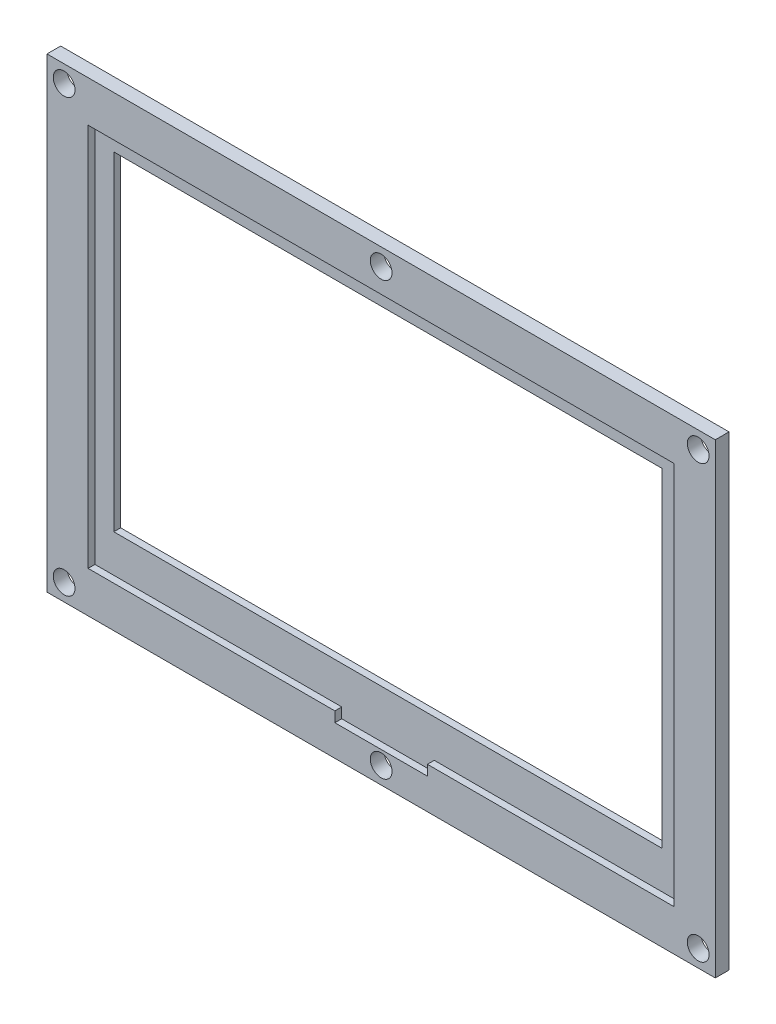
ISO-10303-21;
HEADER;
FILE_DESCRIPTION(('STEP AP214'),'2;1');
FILE_NAME('part.step','',(''),(''),'','','');
FILE_SCHEMA(('AUTOMOTIVE_DESIGN { 1 0 10303 214 1 1 1 1 }'));
ENDSEC;
DATA;
#1=APPLICATION_CONTEXT('core data for automotive mechanical design processes');
#2=APPLICATION_PROTOCOL_DEFINITION('international standard','automotive_design',2000,#1);
#3=PRODUCT_CONTEXT('',#1,'mechanical');
#4=PRODUCT('Part','Part','',(#3));
#5=PRODUCT_RELATED_PRODUCT_CATEGORY('part','',(#4));
#6=PRODUCT_DEFINITION_FORMATION('','',#4);
#7=PRODUCT_DEFINITION_CONTEXT('part definition',#1,'design');
#8=PRODUCT_DEFINITION('design','',#6,#7);
#9=PRODUCT_DEFINITION_SHAPE('','',#8);
#10=(LENGTH_UNIT() NAMED_UNIT(*) SI_UNIT(.MILLI.,.METRE.));
#11=(NAMED_UNIT(*) PLANE_ANGLE_UNIT() SI_UNIT($,.RADIAN.));
#12=(NAMED_UNIT(*) SI_UNIT($,.STERADIAN.) SOLID_ANGLE_UNIT());
#13=UNCERTAINTY_MEASURE_WITH_UNIT(LENGTH_MEASURE(1.E-05),#10,'distance_accuracy_value','');
#14=(GEOMETRIC_REPRESENTATION_CONTEXT(3) GLOBAL_UNCERTAINTY_ASSIGNED_CONTEXT((#13)) GLOBAL_UNIT_ASSIGNED_CONTEXT((#10,
#11,#12)) REPRESENTATION_CONTEXT('',''));
#15=CARTESIAN_POINT('',(0.,0.,0.));
#16=DIRECTION('',(0.,0.,1.));
#17=DIRECTION('',(1.,0.,0.));
#18=AXIS2_PLACEMENT_3D('',#15,#16,#17);
#19=CARTESIAN_POINT('',(0.,0.,0.));
#20=DIRECTION('',(0.,0.,1.));
#21=DIRECTION('',(1.,0.,0.));
#22=AXIS2_PLACEMENT_3D('',#19,#20,#21);
#23=PLANE('',#22);
#24=DIRECTION('',(-1.,0.,0.));
#25=VECTOR('',#24,1.);
#26=CARTESIAN_POINT('',(0.,-45.,0.));
#27=LINE('',#26,#25);
#28=CARTESIAN_POINT('',(80.,-45.,0.));
#29=VERTEX_POINT('',#28);
#30=CARTESIAN_POINT('',(-80.,-45.,0.));
#31=VERTEX_POINT('',#30);
#32=EDGE_CURVE('E188',#29,#31,#27,.T.);
#33=ORIENTED_EDGE('',*,*,#32,.T.);
#34=DIRECTION('',(0.,1.,0.));
#35=VECTOR('',#34,1.);
#36=CARTESIAN_POINT('',(-80.,0.,0.));
#37=LINE('',#36,#35);
#38=CARTESIAN_POINT('',(-80.,51.,0.));
#39=VERTEX_POINT('',#38);
#40=EDGE_CURVE('E193',#31,#39,#37,.T.);
#41=ORIENTED_EDGE('',*,*,#40,.T.);
#42=DIRECTION('',(-1.,0.,0.));
#43=VECTOR('',#42,1.);
#44=CARTESIAN_POINT('',(0.,51.,0.));
#45=LINE('',#44,#43);
#46=CARTESIAN_POINT('',(80.,51.,0.));
#47=VERTEX_POINT('',#46);
#48=EDGE_CURVE('E232',#47,#39,#45,.T.);
#49=ORIENTED_EDGE('',*,*,#48,.F.);
#50=DIRECTION('',(0.,1.,0.));
#51=VECTOR('',#50,1.);
#52=CARTESIAN_POINT('',(80.,0.,0.));
#53=LINE('',#52,#51);
#54=EDGE_CURVE('E204',#29,#47,#53,.T.);
#55=ORIENTED_EDGE('',*,*,#54,.F.);
#56=EDGE_LOOP('',(#33,#41,#49,#55));
#57=FACE_BOUND('',#56,.T.);
#58=DIRECTION('',(0.,-1.,0.));
#59=VECTOR('',#58,1.);
#60=CARTESIAN_POINT('',(13.4999999999999,0.,0.));
#61=LINE('',#60,#59);
#62=CARTESIAN_POINT('',(13.5,-56.,0.));
#63=VERTEX_POINT('',#62);
#64=CARTESIAN_POINT('',(13.5,-59.,0.));
#65=VERTEX_POINT('',#64);
#66=EDGE_CURVE('E63',#63,#65,#61,.T.);
#67=ORIENTED_EDGE('',*,*,#66,.F.);
#68=DIRECTION('',(-1.,0.,0.));
#69=VECTOR('',#68,1.);
#70=CARTESIAN_POINT('',(0.,-56.,0.));
#71=LINE('',#70,#69);
#72=CARTESIAN_POINT('',(85.5,-56.,0.));
#73=VERTEX_POINT('',#72);
#74=EDGE_CURVE('E186',#73,#63,#71,.T.);
#75=ORIENTED_EDGE('',*,*,#74,.F.);
#76=DIRECTION('',(0.,1.,0.));
#77=VECTOR('',#76,1.);
#78=CARTESIAN_POINT('',(85.5,0.,0.));
#79=LINE('',#78,#77);
#80=CARTESIAN_POINT('',(85.5,56.,0.));
#81=VERTEX_POINT('',#80);
#82=EDGE_CURVE('E182',#73,#81,#79,.T.);
#83=ORIENTED_EDGE('',*,*,#82,.T.);
#84=DIRECTION('',(-1.,0.,0.));
#85=VECTOR('',#84,1.);
#86=CARTESIAN_POINT('',(0.,56.,0.));
#87=LINE('',#86,#85);
#88=CARTESIAN_POINT('',(-85.5,56.,0.));
#89=VERTEX_POINT('',#88);
#90=EDGE_CURVE('E327',#81,#89,#87,.T.);
#91=ORIENTED_EDGE('',*,*,#90,.T.);
#92=DIRECTION('',(0.,1.,0.));
#93=VECTOR('',#92,1.);
#94=CARTESIAN_POINT('',(-85.5,0.,0.));
#95=LINE('',#94,#93);
#96=CARTESIAN_POINT('',(-85.5,-56.,0.));
#97=VERTEX_POINT('',#96);
#98=EDGE_CURVE('E323',#97,#89,#95,.T.);
#99=ORIENTED_EDGE('',*,*,#98,.F.);
#100=CARTESIAN_POINT('',(-13.5,-56.,0.));
#101=VERTEX_POINT('',#100);
#102=EDGE_CURVE('E315',#101,#97,#71,.T.);
#103=ORIENTED_EDGE('',*,*,#102,.F.);
#104=DIRECTION('',(0.,-1.,0.));
#105=VECTOR('',#104,1.);
#106=CARTESIAN_POINT('',(-13.5000000000001,0.,0.));
#107=LINE('',#106,#105);
#108=CARTESIAN_POINT('',(-13.5,-59.,0.));
#109=VERTEX_POINT('',#108);
#110=EDGE_CURVE('E320',#101,#109,#107,.T.);
#111=ORIENTED_EDGE('',*,*,#110,.T.);
#112=DIRECTION('',(1.,0.,0.));
#113=VECTOR('',#112,1.);
#114=CARTESIAN_POINT('',(0.,-59.,0.));
#115=LINE('',#114,#113);
#116=EDGE_CURVE('E68',#109,#65,#115,.T.);
#117=ORIENTED_EDGE('',*,*,#116,.T.);
#118=EDGE_LOOP('',(#67,#75,#83,#91,#99,#103,#111,#117));
#119=FACE_BOUND('',#118,.T.);
#120=ADVANCED_FACE('F45',(#57,#119),#23,.T.);
#121=CARTESIAN_POINT('',(0.,68.,-2.));
#122=DIRECTION('',(0.,1.,0.));
#123=DIRECTION('',(0.,0.,1.));
#124=AXIS2_PLACEMENT_3D('',#121,#122,#123);
#125=PLANE('',#124);
#126=DIRECTION('',(0.,0.,1.));
#127=VECTOR('',#126,1.);
#128=CARTESIAN_POINT('',(-97.5,68.,-2.));
#129=LINE('',#128,#127);
#130=CARTESIAN_POINT('',(-97.5,68.,-2.));
#131=VERTEX_POINT('',#130);
#132=CARTESIAN_POINT('',(-97.5,68.,2.));
#133=VERTEX_POINT('',#132);
#134=EDGE_CURVE('E243',#131,#133,#129,.T.);
#135=ORIENTED_EDGE('',*,*,#134,.T.);
#136=DIRECTION('',(-1.,0.,0.));
#137=VECTOR('',#136,1.);
#138=CARTESIAN_POINT('',(0.,68.,2.));
#139=LINE('',#138,#137);
#140=CARTESIAN_POINT('',(97.4999999999999,68.,2.));
#141=VERTEX_POINT('',#140);
#142=EDGE_CURVE('E289',#141,#133,#139,.T.);
#143=ORIENTED_EDGE('',*,*,#142,.F.);
#144=DIRECTION('',(0.,0.,1.));
#145=VECTOR('',#144,1.);
#146=CARTESIAN_POINT('',(97.4999999999999,68.,-2.));
#147=LINE('',#146,#145);
#148=CARTESIAN_POINT('',(97.4999999999999,68.,-2.));
#149=VERTEX_POINT('',#148);
#150=EDGE_CURVE('E11',#149,#141,#147,.T.);
#151=ORIENTED_EDGE('',*,*,#150,.F.);
#152=DIRECTION('',(-1.,0.,0.));
#153=VECTOR('',#152,1.);
#154=CARTESIAN_POINT('',(0.,68.,-2.));
#155=LINE('',#154,#153);
#156=EDGE_CURVE('E214',#149,#131,#155,.T.);
#157=ORIENTED_EDGE('',*,*,#156,.T.);
#158=EDGE_LOOP('',(#135,#143,#151,#157));
#159=FACE_BOUND('',#158,.T.);
#160=ADVANCED_FACE('F285',(#159),#125,.T.);
#161=CARTESIAN_POINT('',(97.4999999999999,0.,-2.));
#162=DIRECTION('',(-1.,0.,0.));
#163=DIRECTION('',(0.,0.,1.));
#164=AXIS2_PLACEMENT_3D('',#161,#162,#163);
#165=PLANE('',#164);
#166=ORIENTED_EDGE('',*,*,#150,.T.);
#167=DIRECTION('',(0.,-1.,0.));
#168=VECTOR('',#167,1.);
#169=CARTESIAN_POINT('',(97.4999999999999,0.,2.));
#170=LINE('',#169,#168);
#171=CARTESIAN_POINT('',(97.4999999999999,-68.,2.));
#172=VERTEX_POINT('',#171);
#173=EDGE_CURVE('E294',#141,#172,#170,.T.);
#174=ORIENTED_EDGE('',*,*,#173,.T.);
#175=DIRECTION('',(0.,0.,1.));
#176=VECTOR('',#175,1.);
#177=CARTESIAN_POINT('',(97.4999999999999,-68.,-2.));
#178=LINE('',#177,#176);
#179=CARTESIAN_POINT('',(97.4999999999999,-68.,-2.));
#180=VERTEX_POINT('',#179);
#181=EDGE_CURVE('E55',#180,#172,#178,.T.);
#182=ORIENTED_EDGE('',*,*,#181,.F.);
#183=DIRECTION('',(0.,-1.,0.));
#184=VECTOR('',#183,1.);
#185=CARTESIAN_POINT('',(97.4999999999999,0.,-2.));
#186=LINE('',#185,#184);
#187=EDGE_CURVE('E225',#149,#180,#186,.T.);
#188=ORIENTED_EDGE('',*,*,#187,.F.);
#189=EDGE_LOOP('',(#166,#174,#182,#188));
#190=FACE_BOUND('',#189,.T.);
#191=ADVANCED_FACE('F293',(#190),#165,.F.);
#192=CARTESIAN_POINT('',(0.,-68.,-2.));
#193=DIRECTION('',(0.,1.,0.));
#194=DIRECTION('',(0.,0.,1.));
#195=AXIS2_PLACEMENT_3D('',#192,#193,#194);
#196=PLANE('',#195);
#197=ORIENTED_EDGE('',*,*,#181,.T.);
#198=DIRECTION('',(-1.,0.,0.));
#199=VECTOR('',#198,1.);
#200=CARTESIAN_POINT('',(0.,-68.,2.));
#201=LINE('',#200,#199);
#202=CARTESIAN_POINT('',(-97.5,-68.,2.));
#203=VERTEX_POINT('',#202);
#204=EDGE_CURVE('E300',#172,#203,#201,.T.);
#205=ORIENTED_EDGE('',*,*,#204,.T.);
#206=DIRECTION('',(0.,0.,1.));
#207=VECTOR('',#206,1.);
#208=CARTESIAN_POINT('',(-97.5,-68.,-2.));
#209=LINE('',#208,#207);
#210=CARTESIAN_POINT('',(-97.5,-68.,-2.));
#211=VERTEX_POINT('',#210);
#212=EDGE_CURVE('E240',#211,#203,#209,.T.);
#213=ORIENTED_EDGE('',*,*,#212,.F.);
#214=DIRECTION('',(-1.,0.,0.));
#215=VECTOR('',#214,1.);
#216=CARTESIAN_POINT('',(0.,-68.,-2.));
#217=LINE('',#216,#215);
#218=EDGE_CURVE('E222',#180,#211,#217,.T.);
#219=ORIENTED_EDGE('',*,*,#218,.F.);
#220=EDGE_LOOP('',(#197,#205,#213,#219));
#221=FACE_BOUND('',#220,.T.);
#222=ADVANCED_FACE('F298',(#221),#196,.F.);
#223=CARTESIAN_POINT('',(0.,-45.,-2.));
#224=DIRECTION('',(0.,1.,0.));
#225=DIRECTION('',(-1.,0.,0.));
#226=AXIS2_PLACEMENT_3D('',#223,#224,#225);
#227=PLANE('',#226);
#228=ORIENTED_EDGE('',*,*,#32,.F.);
#229=DIRECTION('',(0.,0.,1.));
#230=VECTOR('',#229,1.);
#231=CARTESIAN_POINT('',(80.,-45.,-2.));
#232=LINE('',#231,#230);
#233=CARTESIAN_POINT('',(80.,-45.,-2.));
#234=VERTEX_POINT('',#233);
#235=EDGE_CURVE('E246',#234,#29,#232,.T.);
#236=ORIENTED_EDGE('',*,*,#235,.F.);
#237=DIRECTION('',(-1.,0.,0.));
#238=VECTOR('',#237,1.);
#239=CARTESIAN_POINT('',(0.,-45.,-2.));
#240=LINE('',#239,#238);
#241=CARTESIAN_POINT('',(-80.,-45.,-2.));
#242=VERTEX_POINT('',#241);
#243=EDGE_CURVE('E199',#234,#242,#240,.T.);
#244=ORIENTED_EDGE('',*,*,#243,.T.);
#245=DIRECTION('',(0.,0.,1.));
#246=VECTOR('',#245,1.);
#247=CARTESIAN_POINT('',(-80.,-45.,-2.));
#248=LINE('',#247,#246);
#249=EDGE_CURVE('E49',#242,#31,#248,.T.);
#250=ORIENTED_EDGE('',*,*,#249,.T.);
#251=EDGE_LOOP('',(#228,#236,#244,#250));
#252=FACE_BOUND('',#251,.T.);
#253=ADVANCED_FACE('F47',(#252),#227,.T.);
#254=CARTESIAN_POINT('',(80.,0.,-2.));
#255=DIRECTION('',(1.,0.,0.));
#256=DIRECTION('',(0.,0.,-1.));
#257=AXIS2_PLACEMENT_3D('',#254,#255,#256);
#258=PLANE('',#257);
#259=ORIENTED_EDGE('',*,*,#54,.T.);
#260=DIRECTION('',(0.,0.,1.));
#261=VECTOR('',#260,1.);
#262=CARTESIAN_POINT('',(80.,51.,-2.));
#263=LINE('',#262,#261);
#264=CARTESIAN_POINT('',(80.,51.,-2.));
#265=VERTEX_POINT('',#264);
#266=EDGE_CURVE('E249',#265,#47,#263,.T.);
#267=ORIENTED_EDGE('',*,*,#266,.F.);
#268=DIRECTION('',(0.,1.,0.));
#269=VECTOR('',#268,1.);
#270=CARTESIAN_POINT('',(80.,0.,-2.));
#271=LINE('',#270,#269);
#272=EDGE_CURVE('E211',#234,#265,#271,.T.);
#273=ORIENTED_EDGE('',*,*,#272,.F.);
#274=ORIENTED_EDGE('',*,*,#235,.T.);
#275=EDGE_LOOP('',(#259,#267,#273,#274));
#276=FACE_BOUND('',#275,.T.);
#277=ADVANCED_FACE('F268',(#276),#258,.F.);
#278=CARTESIAN_POINT('',(0.,51.,-2.));
#279=DIRECTION('',(0.,1.,0.));
#280=DIRECTION('',(-1.,0.,0.));
#281=AXIS2_PLACEMENT_3D('',#278,#279,#280);
#282=PLANE('',#281);
#283=ORIENTED_EDGE('',*,*,#48,.T.);
#284=DIRECTION('',(0.,0.,1.));
#285=VECTOR('',#284,1.);
#286=CARTESIAN_POINT('',(-80.,51.,-2.));
#287=LINE('',#286,#285);
#288=CARTESIAN_POINT('',(-80.,51.,-2.));
#289=VERTEX_POINT('',#288);
#290=EDGE_CURVE('E252',#289,#39,#287,.T.);
#291=ORIENTED_EDGE('',*,*,#290,.F.);
#292=DIRECTION('',(-1.,0.,0.));
#293=VECTOR('',#292,1.);
#294=CARTESIAN_POINT('',(0.,51.,-2.));
#295=LINE('',#294,#293);
#296=EDGE_CURVE('E208',#265,#289,#295,.T.);
#297=ORIENTED_EDGE('',*,*,#296,.F.);
#298=ORIENTED_EDGE('',*,*,#266,.T.);
#299=EDGE_LOOP('',(#283,#291,#297,#298));
#300=FACE_BOUND('',#299,.T.);
#301=ADVANCED_FACE('F272',(#300),#282,.F.);
#302=CARTESIAN_POINT('',(-80.,0.,-2.));
#303=DIRECTION('',(1.,0.,0.));
#304=DIRECTION('',(0.,0.,-1.));
#305=AXIS2_PLACEMENT_3D('',#302,#303,#304);
#306=PLANE('',#305);
#307=ORIENTED_EDGE('',*,*,#40,.F.);
#308=ORIENTED_EDGE('',*,*,#249,.F.);
#309=DIRECTION('',(0.,1.,0.));
#310=VECTOR('',#309,1.);
#311=CARTESIAN_POINT('',(-80.,0.,-2.));
#312=LINE('',#311,#310);
#313=EDGE_CURVE('E203',#242,#289,#312,.T.);
#314=ORIENTED_EDGE('',*,*,#313,.T.);
#315=ORIENTED_EDGE('',*,*,#290,.T.);
#316=EDGE_LOOP('',(#307,#308,#314,#315));
#317=FACE_BOUND('',#316,.T.);
#318=ADVANCED_FACE('F262',(#317),#306,.T.);
#319=CARTESIAN_POINT('',(-97.5,0.,-2.));
#320=DIRECTION('',(-1.,0.,0.));
#321=DIRECTION('',(0.,0.,1.));
#322=AXIS2_PLACEMENT_3D('',#319,#320,#321);
#323=PLANE('',#322);
#324=ORIENTED_EDGE('',*,*,#212,.T.);
#325=DIRECTION('',(0.,-1.,0.));
#326=VECTOR('',#325,1.);
#327=CARTESIAN_POINT('',(-97.5,0.,2.));
#328=LINE('',#327,#326);
#329=EDGE_CURVE('E302',#133,#203,#328,.T.);
#330=ORIENTED_EDGE('',*,*,#329,.F.);
#331=ORIENTED_EDGE('',*,*,#134,.F.);
#332=DIRECTION('',(0.,-1.,0.));
#333=VECTOR('',#332,1.);
#334=CARTESIAN_POINT('',(-97.5,0.,-2.));
#335=LINE('',#334,#333);
#336=EDGE_CURVE('E218',#131,#211,#335,.T.);
#337=ORIENTED_EDGE('',*,*,#336,.T.);
#338=EDGE_LOOP('',(#324,#330,#331,#337));
#339=FACE_BOUND('',#338,.T.);
#340=ADVANCED_FACE('F277',(#339),#323,.T.);
#341=CARTESIAN_POINT('',(0.,0.,-2.));
#342=DIRECTION('',(0.,0.,1.));
#343=DIRECTION('',(1.,0.,0.));
#344=AXIS2_PLACEMENT_3D('',#341,#342,#343);
#345=PLANE('',#344);
#346=CARTESIAN_POINT('',(-92.5,-63.,-2.));
#347=DIRECTION('',(0.,0.,1.));
#348=DIRECTION('',(1.,0.,0.));
#349=AXIS2_PLACEMENT_3D('',#346,#347,#348);
#350=CIRCLE('',#349,3.175);
#351=CARTESIAN_POINT('',(-89.325,-63.,-2.));
#352=VERTEX_POINT('',#351);
#353=EDGE_CURVE('E385',#352,#352,#350,.T.);
#354=ORIENTED_EDGE('',*,*,#353,.T.);
#355=EDGE_LOOP('',(#354));
#356=FACE_BOUND('',#355,.T.);
#357=CARTESIAN_POINT('',(0.,-63.,-2.));
#358=DIRECTION('',(0.,0.,1.));
#359=DIRECTION('',(1.,0.,0.));
#360=AXIS2_PLACEMENT_3D('',#357,#358,#359);
#361=CIRCLE('',#360,3.175);
#362=CARTESIAN_POINT('',(3.175,-63.,-2.));
#363=VERTEX_POINT('',#362);
#364=EDGE_CURVE('E393',#363,#363,#361,.T.);
#365=ORIENTED_EDGE('',*,*,#364,.T.);
#366=EDGE_LOOP('',(#365));
#367=FACE_BOUND('',#366,.T.);
#368=CARTESIAN_POINT('',(92.5000000000001,-63.,-2.));
#369=DIRECTION('',(0.,0.,1.));
#370=DIRECTION('',(1.,0.,0.));
#371=AXIS2_PLACEMENT_3D('',#368,#369,#370);
#372=CIRCLE('',#371,3.175);
#373=CARTESIAN_POINT('',(95.6750000000001,-63.,-2.));
#374=VERTEX_POINT('',#373);
#375=EDGE_CURVE('E401',#374,#374,#372,.T.);
#376=ORIENTED_EDGE('',*,*,#375,.T.);
#377=EDGE_LOOP('',(#376));
#378=FACE_BOUND('',#377,.T.);
#379=CARTESIAN_POINT('',(92.5000000000001,63.,-2.));
#380=DIRECTION('',(0.,0.,1.));
#381=DIRECTION('',(1.,0.,0.));
#382=AXIS2_PLACEMENT_3D('',#379,#380,#381);
#383=CIRCLE('',#382,3.175);
#384=CARTESIAN_POINT('',(95.6750000000001,63.,-2.));
#385=VERTEX_POINT('',#384);
#386=EDGE_CURVE('E409',#385,#385,#383,.T.);
#387=ORIENTED_EDGE('',*,*,#386,.T.);
#388=EDGE_LOOP('',(#387));
#389=FACE_BOUND('',#388,.T.);
#390=CARTESIAN_POINT('',(0.,63.,-2.));
#391=DIRECTION('',(0.,0.,1.));
#392=DIRECTION('',(1.,0.,0.));
#393=AXIS2_PLACEMENT_3D('',#390,#391,#392);
#394=CIRCLE('',#393,3.175);
#395=CARTESIAN_POINT('',(3.175,63.,-2.));
#396=VERTEX_POINT('',#395);
#397=EDGE_CURVE('E417',#396,#396,#394,.T.);
#398=ORIENTED_EDGE('',*,*,#397,.T.);
#399=EDGE_LOOP('',(#398));
#400=FACE_BOUND('',#399,.T.);
#401=CARTESIAN_POINT('',(-92.5,63.,-2.));
#402=DIRECTION('',(0.,0.,1.));
#403=DIRECTION('',(1.,0.,0.));
#404=AXIS2_PLACEMENT_3D('',#401,#402,#403);
#405=CIRCLE('',#404,3.175);
#406=CARTESIAN_POINT('',(-89.325,63.,-2.));
#407=VERTEX_POINT('',#406);
#408=EDGE_CURVE('E314',#407,#407,#405,.T.);
#409=ORIENTED_EDGE('',*,*,#408,.T.);
#410=EDGE_LOOP('',(#409));
#411=FACE_BOUND('',#410,.T.);
#412=ORIENTED_EDGE('',*,*,#243,.F.);
#413=ORIENTED_EDGE('',*,*,#272,.T.);
#414=ORIENTED_EDGE('',*,*,#296,.T.);
#415=ORIENTED_EDGE('',*,*,#313,.F.);
#416=EDGE_LOOP('',(#412,#413,#414,#415));
#417=FACE_BOUND('',#416,.T.);
#418=ORIENTED_EDGE('',*,*,#156,.F.);
#419=ORIENTED_EDGE('',*,*,#187,.T.);
#420=ORIENTED_EDGE('',*,*,#218,.T.);
#421=ORIENTED_EDGE('',*,*,#336,.F.);
#422=EDGE_LOOP('',(#418,#419,#420,#421));
#423=FACE_BOUND('',#422,.T.);
#424=ADVANCED_FACE('F274',(#356,#367,#378,#389,#400,#411,#417,#423),#345,.F.);
#425=CARTESIAN_POINT('',(0.,-56.,2.));
#426=DIRECTION('',(0.,-1.,0.));
#427=DIRECTION('',(1.,0.,0.));
#428=AXIS2_PLACEMENT_3D('',#425,#426,#427);
#429=PLANE('',#428);
#430=ORIENTED_EDGE('',*,*,#74,.T.);
#431=DIRECTION('',(0.,0.,-1.));
#432=VECTOR('',#431,1.);
#433=CARTESIAN_POINT('',(13.5,-56.,2.));
#434=LINE('',#433,#432);
#435=CARTESIAN_POINT('',(13.5,-56.,2.));
#436=VERTEX_POINT('',#435);
#437=EDGE_CURVE('E162',#436,#63,#434,.T.);
#438=ORIENTED_EDGE('',*,*,#437,.F.);
#439=DIRECTION('',(-1.,0.,0.));
#440=VECTOR('',#439,1.);
#441=CARTESIAN_POINT('',(0.,-56.,2.));
#442=LINE('',#441,#440);
#443=CARTESIAN_POINT('',(85.5,-56.,2.));
#444=VERTEX_POINT('',#443);
#445=EDGE_CURVE('E170',#444,#436,#442,.T.);
#446=ORIENTED_EDGE('',*,*,#445,.F.);
#447=DIRECTION('',(0.,0.,-1.));
#448=VECTOR('',#447,1.);
#449=CARTESIAN_POINT('',(85.5,-56.,2.));
#450=LINE('',#449,#448);
#451=EDGE_CURVE('E307',#444,#73,#450,.T.);
#452=ORIENTED_EDGE('',*,*,#451,.T.);
#453=EDGE_LOOP('',(#430,#438,#446,#452));
#454=FACE_BOUND('',#453,.T.);
#455=ADVANCED_FACE('F185',(#454),#429,.F.);
#456=CARTESIAN_POINT('',(13.4999999999999,0.,2.));
#457=DIRECTION('',(1.,0.,0.));
#458=DIRECTION('',(0.,1.,0.));
#459=AXIS2_PLACEMENT_3D('',#456,#457,#458);
#460=PLANE('',#459);
#461=ORIENTED_EDGE('',*,*,#66,.T.);
#462=DIRECTION('',(0.,0.,-1.));
#463=VECTOR('',#462,1.);
#464=CARTESIAN_POINT('',(13.5,-59.,2.));
#465=LINE('',#464,#463);
#466=CARTESIAN_POINT('',(13.5,-59.,2.));
#467=VERTEX_POINT('',#466);
#468=EDGE_CURVE('E164',#467,#65,#465,.T.);
#469=ORIENTED_EDGE('',*,*,#468,.F.);
#470=DIRECTION('',(0.,-1.,0.));
#471=VECTOR('',#470,1.);
#472=CARTESIAN_POINT('',(13.4999999999999,0.,2.));
#473=LINE('',#472,#471);
#474=EDGE_CURVE('E158',#436,#467,#473,.T.);
#475=ORIENTED_EDGE('',*,*,#474,.F.);
#476=ORIENTED_EDGE('',*,*,#437,.T.);
#477=EDGE_LOOP('',(#461,#469,#475,#476));
#478=FACE_BOUND('',#477,.T.);
#479=ADVANCED_FACE('F160',(#478),#460,.F.);
#480=CARTESIAN_POINT('',(0.,-59.,2.));
#481=DIRECTION('',(0.,1.,0.));
#482=DIRECTION('',(0.,0.,1.));
#483=AXIS2_PLACEMENT_3D('',#480,#481,#482);
#484=PLANE('',#483);
#485=ORIENTED_EDGE('',*,*,#116,.F.);
#486=DIRECTION('',(0.,0.,-1.));
#487=VECTOR('',#486,1.);
#488=CARTESIAN_POINT('',(-13.5,-59.,2.));
#489=LINE('',#488,#487);
#490=CARTESIAN_POINT('',(-13.5,-59.,2.));
#491=VERTEX_POINT('',#490);
#492=EDGE_CURVE('E195',#491,#109,#489,.T.);
#493=ORIENTED_EDGE('',*,*,#492,.F.);
#494=DIRECTION('',(1.,0.,0.));
#495=VECTOR('',#494,1.);
#496=CARTESIAN_POINT('',(0.,-59.,2.));
#497=LINE('',#496,#495);
#498=EDGE_CURVE('E169',#491,#467,#497,.T.);
#499=ORIENTED_EDGE('',*,*,#498,.T.);
#500=ORIENTED_EDGE('',*,*,#468,.T.);
#501=EDGE_LOOP('',(#485,#493,#499,#500));
#502=FACE_BOUND('',#501,.T.);
#503=ADVANCED_FACE('F358',(#502),#484,.T.);
#504=CARTESIAN_POINT('',(-13.5000000000001,0.,2.));
#505=DIRECTION('',(1.,0.,0.));
#506=DIRECTION('',(0.,1.,0.));
#507=AXIS2_PLACEMENT_3D('',#504,#505,#506);
#508=PLANE('',#507);
#509=ORIENTED_EDGE('',*,*,#110,.F.);
#510=DIRECTION('',(0.,0.,-1.));
#511=VECTOR('',#510,1.);
#512=CARTESIAN_POINT('',(-13.5,-56.,2.));
#513=LINE('',#512,#511);
#514=CARTESIAN_POINT('',(-13.5,-56.,2.));
#515=VERTEX_POINT('',#514);
#516=EDGE_CURVE('E346',#515,#101,#513,.T.);
#517=ORIENTED_EDGE('',*,*,#516,.F.);
#518=DIRECTION('',(0.,-1.,0.));
#519=VECTOR('',#518,1.);
#520=CARTESIAN_POINT('',(-13.5000000000001,0.,2.));
#521=LINE('',#520,#519);
#522=EDGE_CURVE('E356',#515,#491,#521,.T.);
#523=ORIENTED_EDGE('',*,*,#522,.T.);
#524=ORIENTED_EDGE('',*,*,#492,.T.);
#525=EDGE_LOOP('',(#509,#517,#523,#524));
#526=FACE_BOUND('',#525,.T.);
#527=ADVANCED_FACE('F354',(#526),#508,.T.);
#528=ORIENTED_EDGE('',*,*,#102,.T.);
#529=DIRECTION('',(0.,0.,-1.));
#530=VECTOR('',#529,1.);
#531=CARTESIAN_POINT('',(-85.5,-56.,2.));
#532=LINE('',#531,#530);
#533=CARTESIAN_POINT('',(-85.5,-56.,2.));
#534=VERTEX_POINT('',#533);
#535=EDGE_CURVE('E342',#534,#97,#532,.T.);
#536=ORIENTED_EDGE('',*,*,#535,.F.);
#537=EDGE_CURVE('E184',#515,#534,#442,.T.);
#538=ORIENTED_EDGE('',*,*,#537,.F.);
#539=ORIENTED_EDGE('',*,*,#516,.T.);
#540=EDGE_LOOP('',(#528,#536,#538,#539));
#541=FACE_BOUND('',#540,.T.);
#542=ADVANCED_FACE('F487',(#541),#429,.F.);
#543=CARTESIAN_POINT('',(-85.5,0.,2.));
#544=DIRECTION('',(-1.,0.,0.));
#545=DIRECTION('',(0.,0.,1.));
#546=AXIS2_PLACEMENT_3D('',#543,#544,#545);
#547=PLANE('',#546);
#548=ORIENTED_EDGE('',*,*,#98,.T.);
#549=DIRECTION('',(0.,0.,-1.));
#550=VECTOR('',#549,1.);
#551=CARTESIAN_POINT('',(-85.5,56.,2.));
#552=LINE('',#551,#550);
#553=CARTESIAN_POINT('',(-85.5,56.,2.));
#554=VERTEX_POINT('',#553);
#555=EDGE_CURVE('E338',#554,#89,#552,.T.);
#556=ORIENTED_EDGE('',*,*,#555,.F.);
#557=DIRECTION('',(0.,1.,0.));
#558=VECTOR('',#557,1.);
#559=CARTESIAN_POINT('',(-85.5,0.,2.));
#560=LINE('',#559,#558);
#561=EDGE_CURVE('E364',#534,#554,#560,.T.);
#562=ORIENTED_EDGE('',*,*,#561,.F.);
#563=ORIENTED_EDGE('',*,*,#535,.T.);
#564=EDGE_LOOP('',(#548,#556,#562,#563));
#565=FACE_BOUND('',#564,.T.);
#566=ADVANCED_FACE('F510',(#565),#547,.F.);
#567=CARTESIAN_POINT('',(0.,56.,2.));
#568=DIRECTION('',(0.,-1.,0.));
#569=DIRECTION('',(1.,0.,0.));
#570=AXIS2_PLACEMENT_3D('',#567,#568,#569);
#571=PLANE('',#570);
#572=ORIENTED_EDGE('',*,*,#90,.F.);
#573=DIRECTION('',(0.,0.,-1.));
#574=VECTOR('',#573,1.);
#575=CARTESIAN_POINT('',(85.5,56.,2.));
#576=LINE('',#575,#574);
#577=CARTESIAN_POINT('',(85.5,56.,2.));
#578=VERTEX_POINT('',#577);
#579=EDGE_CURVE('E334',#578,#81,#576,.T.);
#580=ORIENTED_EDGE('',*,*,#579,.F.);
#581=DIRECTION('',(-1.,0.,0.));
#582=VECTOR('',#581,1.);
#583=CARTESIAN_POINT('',(0.,56.,2.));
#584=LINE('',#583,#582);
#585=EDGE_CURVE('E367',#578,#554,#584,.T.);
#586=ORIENTED_EDGE('',*,*,#585,.T.);
#587=ORIENTED_EDGE('',*,*,#555,.T.);
#588=EDGE_LOOP('',(#572,#580,#586,#587));
#589=FACE_BOUND('',#588,.T.);
#590=ADVANCED_FACE('F517',(#589),#571,.T.);
#591=CARTESIAN_POINT('',(85.5,0.,2.));
#592=DIRECTION('',(-1.,0.,0.));
#593=DIRECTION('',(0.,0.,1.));
#594=AXIS2_PLACEMENT_3D('',#591,#592,#593);
#595=PLANE('',#594);
#596=ORIENTED_EDGE('',*,*,#82,.F.);
#597=ORIENTED_EDGE('',*,*,#451,.F.);
#598=DIRECTION('',(0.,1.,0.));
#599=VECTOR('',#598,1.);
#600=CARTESIAN_POINT('',(85.5,0.,2.));
#601=LINE('',#600,#599);
#602=EDGE_CURVE('E178',#444,#578,#601,.T.);
#603=ORIENTED_EDGE('',*,*,#602,.T.);
#604=ORIENTED_EDGE('',*,*,#579,.T.);
#605=EDGE_LOOP('',(#596,#597,#603,#604));
#606=FACE_BOUND('',#605,.T.);
#607=ADVANCED_FACE('F430',(#606),#595,.T.);
#608=CARTESIAN_POINT('',(0.,0.,2.));
#609=DIRECTION('',(0.,0.,1.));
#610=DIRECTION('',(1.,0.,0.));
#611=AXIS2_PLACEMENT_3D('',#608,#609,#610);
#612=PLANE('',#611);
#613=CARTESIAN_POINT('',(-92.5,-63.,2.));
#614=DIRECTION('',(0.,0.,1.));
#615=DIRECTION('',(1.,0.,0.));
#616=AXIS2_PLACEMENT_3D('',#613,#614,#615);
#617=CIRCLE('',#616,3.175);
#618=CARTESIAN_POINT('',(-89.325,-63.,2.));
#619=VERTEX_POINT('',#618);
#620=EDGE_CURVE('E389',#619,#619,#617,.T.);
#621=ORIENTED_EDGE('',*,*,#620,.F.);
#622=EDGE_LOOP('',(#621));
#623=FACE_BOUND('',#622,.T.);
#624=CARTESIAN_POINT('',(0.,-63.,2.));
#625=DIRECTION('',(0.,0.,1.));
#626=DIRECTION('',(1.,0.,0.));
#627=AXIS2_PLACEMENT_3D('',#624,#625,#626);
#628=CIRCLE('',#627,3.175);
#629=CARTESIAN_POINT('',(3.175,-63.,2.));
#630=VERTEX_POINT('',#629);
#631=EDGE_CURVE('E397',#630,#630,#628,.T.);
#632=ORIENTED_EDGE('',*,*,#631,.F.);
#633=EDGE_LOOP('',(#632));
#634=FACE_BOUND('',#633,.T.);
#635=CARTESIAN_POINT('',(92.5000000000001,-63.,2.));
#636=DIRECTION('',(0.,0.,1.));
#637=DIRECTION('',(1.,0.,0.));
#638=AXIS2_PLACEMENT_3D('',#635,#636,#637);
#639=CIRCLE('',#638,3.175);
#640=CARTESIAN_POINT('',(95.6750000000001,-63.,2.));
#641=VERTEX_POINT('',#640);
#642=EDGE_CURVE('E405',#641,#641,#639,.T.);
#643=ORIENTED_EDGE('',*,*,#642,.F.);
#644=EDGE_LOOP('',(#643));
#645=FACE_BOUND('',#644,.T.);
#646=CARTESIAN_POINT('',(92.5000000000001,63.,2.));
#647=DIRECTION('',(0.,0.,1.));
#648=DIRECTION('',(1.,0.,0.));
#649=AXIS2_PLACEMENT_3D('',#646,#647,#648);
#650=CIRCLE('',#649,3.175);
#651=CARTESIAN_POINT('',(95.6750000000001,63.,2.));
#652=VERTEX_POINT('',#651);
#653=EDGE_CURVE('E413',#652,#652,#650,.T.);
#654=ORIENTED_EDGE('',*,*,#653,.F.);
#655=EDGE_LOOP('',(#654));
#656=FACE_BOUND('',#655,.T.);
#657=CARTESIAN_POINT('',(0.,63.,2.));
#658=DIRECTION('',(0.,0.,1.));
#659=DIRECTION('',(1.,0.,0.));
#660=AXIS2_PLACEMENT_3D('',#657,#658,#659);
#661=CIRCLE('',#660,3.175);
#662=CARTESIAN_POINT('',(3.175,63.,2.));
#663=VERTEX_POINT('',#662);
#664=EDGE_CURVE('E381',#663,#663,#661,.T.);
#665=ORIENTED_EDGE('',*,*,#664,.F.);
#666=EDGE_LOOP('',(#665));
#667=FACE_BOUND('',#666,.T.);
#668=CARTESIAN_POINT('',(-92.5,63.,2.));
#669=DIRECTION('',(0.,0.,1.));
#670=DIRECTION('',(1.,0.,0.));
#671=AXIS2_PLACEMENT_3D('',#668,#669,#670);
#672=CIRCLE('',#671,3.175);
#673=CARTESIAN_POINT('',(-89.325,63.,2.));
#674=VERTEX_POINT('',#673);
#675=EDGE_CURVE('E377',#674,#674,#672,.T.);
#676=ORIENTED_EDGE('',*,*,#675,.F.);
#677=EDGE_LOOP('',(#676));
#678=FACE_BOUND('',#677,.T.);
#679=ORIENTED_EDGE('',*,*,#445,.T.);
#680=ORIENTED_EDGE('',*,*,#474,.T.);
#681=ORIENTED_EDGE('',*,*,#498,.F.);
#682=ORIENTED_EDGE('',*,*,#522,.F.);
#683=ORIENTED_EDGE('',*,*,#537,.T.);
#684=ORIENTED_EDGE('',*,*,#561,.T.);
#685=ORIENTED_EDGE('',*,*,#585,.F.);
#686=ORIENTED_EDGE('',*,*,#602,.F.);
#687=EDGE_LOOP('',(#679,#680,#681,#682,#683,#684,#685,#686));
#688=FACE_BOUND('',#687,.T.);
#689=ORIENTED_EDGE('',*,*,#142,.T.);
#690=ORIENTED_EDGE('',*,*,#329,.T.);
#691=ORIENTED_EDGE('',*,*,#204,.F.);
#692=ORIENTED_EDGE('',*,*,#173,.F.);
#693=EDGE_LOOP('',(#689,#690,#691,#692));
#694=FACE_BOUND('',#693,.T.);
#695=ADVANCED_FACE('F174',(#623,#634,#645,#656,#667,#678,#688,#694),#612,.T.);
#696=CARTESIAN_POINT('',(-92.5,63.,-2.));
#697=DIRECTION('',(0.,0.,1.));
#698=DIRECTION('',(1.,0.,0.));
#699=AXIS2_PLACEMENT_3D('',#696,#697,#698);
#700=CYLINDRICAL_SURFACE('',#699,3.175);
#701=ORIENTED_EDGE('',*,*,#408,.F.);
#702=EDGE_LOOP('',(#701));
#703=FACE_BOUND('',#702,.T.);
#704=ORIENTED_EDGE('',*,*,#675,.T.);
#705=EDGE_LOOP('',(#704));
#706=FACE_BOUND('',#705,.T.);
#707=ADVANCED_FACE('F429',(#703,#706),#700,.F.);
#708=CARTESIAN_POINT('',(0.,63.,-2.));
#709=DIRECTION('',(0.,0.,1.));
#710=DIRECTION('',(1.,0.,0.));
#711=AXIS2_PLACEMENT_3D('',#708,#709,#710);
#712=CYLINDRICAL_SURFACE('',#711,3.175);
#713=ORIENTED_EDGE('',*,*,#397,.F.);
#714=EDGE_LOOP('',(#713));
#715=FACE_BOUND('',#714,.T.);
#716=ORIENTED_EDGE('',*,*,#664,.T.);
#717=EDGE_LOOP('',(#716));
#718=FACE_BOUND('',#717,.T.);
#719=ADVANCED_FACE('F425',(#715,#718),#712,.F.);
#720=CARTESIAN_POINT('',(92.5000000000001,63.,-2.));
#721=DIRECTION('',(0.,0.,1.));
#722=DIRECTION('',(1.,0.,0.));
#723=AXIS2_PLACEMENT_3D('',#720,#721,#722);
#724=CYLINDRICAL_SURFACE('',#723,3.175);
#725=ORIENTED_EDGE('',*,*,#386,.F.);
#726=EDGE_LOOP('',(#725));
#727=FACE_BOUND('',#726,.T.);
#728=ORIENTED_EDGE('',*,*,#653,.T.);
#729=EDGE_LOOP('',(#728));
#730=FACE_BOUND('',#729,.T.);
#731=ADVANCED_FACE('F441',(#727,#730),#724,.F.);
#732=CARTESIAN_POINT('',(92.5000000000001,-63.,-2.));
#733=DIRECTION('',(0.,0.,1.));
#734=DIRECTION('',(1.,0.,0.));
#735=AXIS2_PLACEMENT_3D('',#732,#733,#734);
#736=CYLINDRICAL_SURFACE('',#735,3.175);
#737=ORIENTED_EDGE('',*,*,#375,.F.);
#738=EDGE_LOOP('',(#737));
#739=FACE_BOUND('',#738,.T.);
#740=ORIENTED_EDGE('',*,*,#642,.T.);
#741=EDGE_LOOP('',(#740));
#742=FACE_BOUND('',#741,.T.);
#743=ADVANCED_FACE('F557',(#739,#742),#736,.F.);
#744=CARTESIAN_POINT('',(0.,-63.,-2.));
#745=DIRECTION('',(0.,0.,1.));
#746=DIRECTION('',(1.,0.,0.));
#747=AXIS2_PLACEMENT_3D('',#744,#745,#746);
#748=CYLINDRICAL_SURFACE('',#747,3.175);
#749=ORIENTED_EDGE('',*,*,#364,.F.);
#750=EDGE_LOOP('',(#749));
#751=FACE_BOUND('',#750,.T.);
#752=ORIENTED_EDGE('',*,*,#631,.T.);
#753=EDGE_LOOP('',(#752));
#754=FACE_BOUND('',#753,.T.);
#755=ADVANCED_FACE('F568',(#751,#754),#748,.F.);
#756=CARTESIAN_POINT('',(-92.5,-63.,-2.));
#757=DIRECTION('',(0.,0.,1.));
#758=DIRECTION('',(1.,0.,0.));
#759=AXIS2_PLACEMENT_3D('',#756,#757,#758);
#760=CYLINDRICAL_SURFACE('',#759,3.175);
#761=ORIENTED_EDGE('',*,*,#353,.F.);
#762=EDGE_LOOP('',(#761));
#763=FACE_BOUND('',#762,.T.);
#764=ORIENTED_EDGE('',*,*,#620,.T.);
#765=EDGE_LOOP('',(#764));
#766=FACE_BOUND('',#765,.T.);
#767=ADVANCED_FACE('F579',(#763,#766),#760,.F.);
#768=CLOSED_SHELL('',(#120,#160,#191,#222,#253,#277,#301,#318,#340,#424,#455,#479,#503,#527,
#542,#566,#590,#607,#695,#707,#719,#731,#743,#755,#767));
#769=MANIFOLD_SOLID_BREP('B2',#768);
#770=ADVANCED_BREP_SHAPE_REPRESENTATION('',(#18,#769),#14);
#771=SHAPE_DEFINITION_REPRESENTATION(#9,#770);
ENDSEC;
END-ISO-10303-21;
